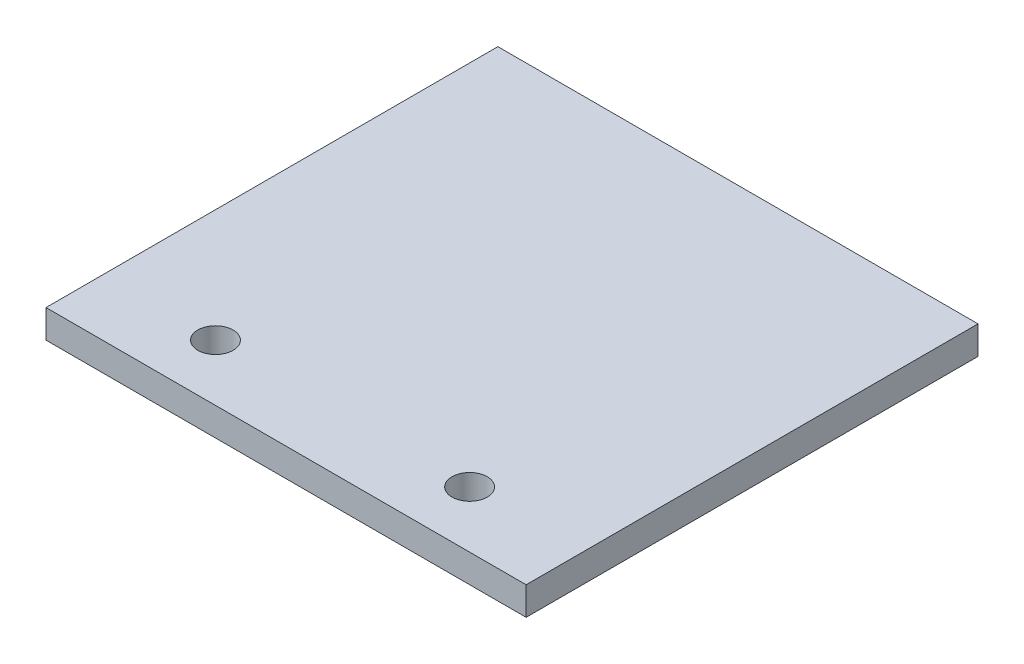
ISO-10303-21;
HEADER;
FILE_DESCRIPTION(('STEP AP214'),'2;1');
FILE_NAME('part.step','',(''),(''),'','','');
FILE_SCHEMA(('AUTOMOTIVE_DESIGN { 1 0 10303 214 1 1 1 1 }'));
ENDSEC;
DATA;
#1=APPLICATION_CONTEXT('core data for automotive mechanical design processes');
#2=APPLICATION_PROTOCOL_DEFINITION('international standard','automotive_design',2000,#1);
#3=PRODUCT_CONTEXT('',#1,'mechanical');
#4=PRODUCT('Part','Part','',(#3));
#5=PRODUCT_RELATED_PRODUCT_CATEGORY('part','',(#4));
#6=PRODUCT_DEFINITION_FORMATION('','',#4);
#7=PRODUCT_DEFINITION_CONTEXT('part definition',#1,'design');
#8=PRODUCT_DEFINITION('design','',#6,#7);
#9=PRODUCT_DEFINITION_SHAPE('','',#8);
#10=(LENGTH_UNIT() NAMED_UNIT(*) SI_UNIT(.MILLI.,.METRE.));
#11=(NAMED_UNIT(*) PLANE_ANGLE_UNIT() SI_UNIT($,.RADIAN.));
#12=(NAMED_UNIT(*) SI_UNIT($,.STERADIAN.) SOLID_ANGLE_UNIT());
#13=UNCERTAINTY_MEASURE_WITH_UNIT(LENGTH_MEASURE(1.E-05),#10,'distance_accuracy_value','');
#14=(GEOMETRIC_REPRESENTATION_CONTEXT(3) GLOBAL_UNCERTAINTY_ASSIGNED_CONTEXT((#13)) GLOBAL_UNIT_ASSIGNED_CONTEXT((#10,
#11,#12)) REPRESENTATION_CONTEXT('',''));
#15=CARTESIAN_POINT('',(0.,0.,0.));
#16=DIRECTION('',(0.,0.,1.));
#17=DIRECTION('',(1.,0.,0.));
#18=AXIS2_PLACEMENT_3D('',#15,#16,#17);
#19=CARTESIAN_POINT('',(53.975,6.35,-50.8));
#20=DIRECTION('',(-1.,0.,0.));
#21=DIRECTION('',(0.,0.,1.));
#22=AXIS2_PLACEMENT_3D('',#19,#20,#21);
#23=PLANE('',#22);
#24=DIRECTION('',(0.,0.,-1.));
#25=VECTOR('',#24,1.);
#26=CARTESIAN_POINT('',(53.975,0.,-50.8));
#27=LINE('',#26,#25);
#28=CARTESIAN_POINT('',(53.975,0.,50.8));
#29=VERTEX_POINT('',#28);
#30=CARTESIAN_POINT('',(53.975,0.,-50.8));
#31=VERTEX_POINT('',#30);
#32=EDGE_CURVE('E96',#29,#31,#27,.T.);
#33=ORIENTED_EDGE('',*,*,#32,.T.);
#34=DIRECTION('',(0.,-1.,0.));
#35=VECTOR('',#34,1.);
#36=CARTESIAN_POINT('',(53.975,6.35,-50.8));
#37=LINE('',#36,#35);
#38=CARTESIAN_POINT('',(53.975,6.35,-50.8));
#39=VERTEX_POINT('',#38);
#40=EDGE_CURVE('E11',#39,#31,#37,.T.);
#41=ORIENTED_EDGE('',*,*,#40,.F.);
#42=DIRECTION('',(0.,0.,-1.));
#43=VECTOR('',#42,1.);
#44=CARTESIAN_POINT('',(53.975,6.35,-50.8));
#45=LINE('',#44,#43);
#46=CARTESIAN_POINT('',(53.975,6.35,50.8));
#47=VERTEX_POINT('',#46);
#48=EDGE_CURVE('E84',#47,#39,#45,.T.);
#49=ORIENTED_EDGE('',*,*,#48,.F.);
#50=DIRECTION('',(0.,-1.,0.));
#51=VECTOR('',#50,1.);
#52=CARTESIAN_POINT('',(53.975,6.35,50.8));
#53=LINE('',#52,#51);
#54=EDGE_CURVE('E92',#47,#29,#53,.T.);
#55=ORIENTED_EDGE('',*,*,#54,.T.);
#56=EDGE_LOOP('',(#33,#41,#49,#55));
#57=FACE_BOUND('',#56,.T.);
#58=ADVANCED_FACE('F33',(#57),#23,.F.);
#59=CARTESIAN_POINT('',(-53.975,6.35,-50.8));
#60=DIRECTION('',(0.,0.,1.));
#61=DIRECTION('',(1.,0.,0.));
#62=AXIS2_PLACEMENT_3D('',#59,#60,#61);
#63=PLANE('',#62);
#64=DIRECTION('',(-1.,0.,0.));
#65=VECTOR('',#64,1.);
#66=CARTESIAN_POINT('',(-53.975,0.,-50.8));
#67=LINE('',#66,#65);
#68=CARTESIAN_POINT('',(-53.975,0.,-50.8));
#69=VERTEX_POINT('',#68);
#70=EDGE_CURVE('E88',#31,#69,#67,.T.);
#71=ORIENTED_EDGE('',*,*,#70,.T.);
#72=DIRECTION('',(0.,-1.,0.));
#73=VECTOR('',#72,1.);
#74=CARTESIAN_POINT('',(-53.975,6.35,-50.8));
#75=LINE('',#74,#73);
#76=CARTESIAN_POINT('',(-53.975,6.35,-50.8));
#77=VERTEX_POINT('',#76);
#78=EDGE_CURVE('E41',#77,#69,#75,.T.);
#79=ORIENTED_EDGE('',*,*,#78,.F.);
#80=DIRECTION('',(-1.,0.,0.));
#81=VECTOR('',#80,1.);
#82=CARTESIAN_POINT('',(-53.975,6.35,-50.8));
#83=LINE('',#82,#81);
#84=EDGE_CURVE('E79',#39,#77,#83,.T.);
#85=ORIENTED_EDGE('',*,*,#84,.F.);
#86=ORIENTED_EDGE('',*,*,#40,.T.);
#87=EDGE_LOOP('',(#71,#79,#85,#86));
#88=FACE_BOUND('',#87,.T.);
#89=ADVANCED_FACE('F87',(#88),#63,.F.);
#90=CARTESIAN_POINT('',(-53.975,6.35,-50.8));
#91=DIRECTION('',(1.,0.,0.));
#92=DIRECTION('',(0.,0.,-1.));
#93=AXIS2_PLACEMENT_3D('',#90,#91,#92);
#94=PLANE('',#93);
#95=DIRECTION('',(0.,0.,1.));
#96=VECTOR('',#95,1.);
#97=CARTESIAN_POINT('',(-53.975,0.,-50.8));
#98=LINE('',#97,#96);
#99=CARTESIAN_POINT('',(-53.975,0.,50.8));
#100=VERTEX_POINT('',#99);
#101=EDGE_CURVE('E66',#69,#100,#98,.T.);
#102=ORIENTED_EDGE('',*,*,#101,.T.);
#103=DIRECTION('',(0.,-1.,0.));
#104=VECTOR('',#103,1.);
#105=CARTESIAN_POINT('',(-53.975,6.35,50.8));
#106=LINE('',#105,#104);
#107=CARTESIAN_POINT('',(-53.975,6.35,50.8));
#108=VERTEX_POINT('',#107);
#109=EDGE_CURVE('E89',#108,#100,#106,.T.);
#110=ORIENTED_EDGE('',*,*,#109,.F.);
#111=DIRECTION('',(0.,0.,1.));
#112=VECTOR('',#111,1.);
#113=CARTESIAN_POINT('',(-53.975,6.35,-50.8));
#114=LINE('',#113,#112);
#115=EDGE_CURVE('E82',#77,#108,#114,.T.);
#116=ORIENTED_EDGE('',*,*,#115,.F.);
#117=ORIENTED_EDGE('',*,*,#78,.T.);
#118=EDGE_LOOP('',(#102,#110,#116,#117));
#119=FACE_BOUND('',#118,.T.);
#120=ADVANCED_FACE('F90',(#119),#94,.F.);
#121=CARTESIAN_POINT('',(-53.975,6.35,50.8));
#122=DIRECTION('',(0.,0.,-1.));
#123=DIRECTION('',(-1.,0.,0.));
#124=AXIS2_PLACEMENT_3D('',#121,#122,#123);
#125=PLANE('',#124);
#126=DIRECTION('',(1.,0.,0.));
#127=VECTOR('',#126,1.);
#128=CARTESIAN_POINT('',(-53.975,0.,50.8));
#129=LINE('',#128,#127);
#130=EDGE_CURVE('E72',#100,#29,#129,.T.);
#131=ORIENTED_EDGE('',*,*,#130,.T.);
#132=ORIENTED_EDGE('',*,*,#54,.F.);
#133=DIRECTION('',(1.,0.,0.));
#134=VECTOR('',#133,1.);
#135=CARTESIAN_POINT('',(-53.975,6.35,50.8));
#136=LINE('',#135,#134);
#137=EDGE_CURVE('E49',#108,#47,#136,.T.);
#138=ORIENTED_EDGE('',*,*,#137,.F.);
#139=ORIENTED_EDGE('',*,*,#109,.T.);
#140=EDGE_LOOP('',(#131,#132,#138,#139));
#141=FACE_BOUND('',#140,.T.);
#142=ADVANCED_FACE('F104',(#141),#125,.F.);
#143=CARTESIAN_POINT('',(0.,6.35,0.));
#144=DIRECTION('',(0.,1.,0.));
#145=DIRECTION('',(0.,0.,1.));
#146=AXIS2_PLACEMENT_3D('',#143,#144,#145);
#147=PLANE('',#146);
#148=CARTESIAN_POINT('',(28.575,6.35,38.1));
#149=DIRECTION('',(0.,1.,0.));
#150=DIRECTION('',(0.,0.,-1.));
#151=AXIS2_PLACEMENT_3D('',#148,#149,#150);
#152=CIRCLE('',#151,3.96875);
#153=CARTESIAN_POINT('',(28.575,6.35,34.13125));
#154=VERTEX_POINT('',#153);
#155=EDGE_CURVE('E118',#154,#154,#152,.T.);
#156=ORIENTED_EDGE('',*,*,#155,.F.);
#157=EDGE_LOOP('',(#156));
#158=FACE_BOUND('',#157,.T.);
#159=CARTESIAN_POINT('',(-28.575,6.35,38.1));
#160=DIRECTION('',(0.,1.,0.));
#161=DIRECTION('',(0.,0.,1.));
#162=AXIS2_PLACEMENT_3D('',#159,#160,#161);
#163=CIRCLE('',#162,3.96875);
#164=CARTESIAN_POINT('',(-28.575,6.35,42.06875));
#165=VERTEX_POINT('',#164);
#166=EDGE_CURVE('E112',#165,#165,#163,.T.);
#167=ORIENTED_EDGE('',*,*,#166,.F.);
#168=EDGE_LOOP('',(#167));
#169=FACE_BOUND('',#168,.T.);
#170=ORIENTED_EDGE('',*,*,#48,.T.);
#171=ORIENTED_EDGE('',*,*,#84,.T.);
#172=ORIENTED_EDGE('',*,*,#115,.T.);
#173=ORIENTED_EDGE('',*,*,#137,.T.);
#174=EDGE_LOOP('',(#170,#171,#172,#173));
#175=FACE_BOUND('',#174,.T.);
#176=ADVANCED_FACE('F80',(#158,#169,#175),#147,.T.);
#177=CARTESIAN_POINT('',(0.,0.,0.));
#178=DIRECTION('',(0.,1.,0.));
#179=DIRECTION('',(0.,0.,1.));
#180=AXIS2_PLACEMENT_3D('',#177,#178,#179);
#181=PLANE('',#180);
#182=CARTESIAN_POINT('',(28.575,0.,38.1));
#183=DIRECTION('',(0.,1.,0.));
#184=DIRECTION('',(0.,0.,1.));
#185=AXIS2_PLACEMENT_3D('',#182,#183,#184);
#186=CIRCLE('',#185,3.96875);
#187=CARTESIAN_POINT('',(28.575,0.,42.06875));
#188=VERTEX_POINT('',#187);
#189=EDGE_CURVE('E115',#188,#188,#186,.F.);
#190=ORIENTED_EDGE('',*,*,#189,.F.);
#191=EDGE_LOOP('',(#190));
#192=FACE_BOUND('',#191,.T.);
#193=CARTESIAN_POINT('',(-28.575,0.,38.1));
#194=DIRECTION('',(0.,1.,0.));
#195=DIRECTION('',(0.,0.,1.));
#196=AXIS2_PLACEMENT_3D('',#193,#194,#195);
#197=CIRCLE('',#196,3.96875);
#198=CARTESIAN_POINT('',(-28.575,0.,42.06875));
#199=VERTEX_POINT('',#198);
#200=EDGE_CURVE('E99',#199,#199,#197,.F.);
#201=ORIENTED_EDGE('',*,*,#200,.F.);
#202=EDGE_LOOP('',(#201));
#203=FACE_BOUND('',#202,.T.);
#204=ORIENTED_EDGE('',*,*,#32,.F.);
#205=ORIENTED_EDGE('',*,*,#130,.F.);
#206=ORIENTED_EDGE('',*,*,#101,.F.);
#207=ORIENTED_EDGE('',*,*,#70,.F.);
#208=EDGE_LOOP('',(#204,#205,#206,#207));
#209=FACE_BOUND('',#208,.T.);
#210=ADVANCED_FACE('F107',(#192,#203,#209),#181,.F.);
#211=CARTESIAN_POINT('',(-28.575,-0.00100000000000013,38.1));
#212=DIRECTION('',(0.,1.,0.));
#213=DIRECTION('',(0.,0.,1.));
#214=AXIS2_PLACEMENT_3D('',#211,#212,#213);
#215=CYLINDRICAL_SURFACE('',#214,3.96875);
#216=ORIENTED_EDGE('',*,*,#166,.T.);
#217=EDGE_LOOP('',(#216));
#218=FACE_BOUND('',#217,.T.);
#219=ORIENTED_EDGE('',*,*,#200,.T.);
#220=EDGE_LOOP('',(#219));
#221=FACE_BOUND('',#220,.T.);
#222=ADVANCED_FACE('F130',(#218,#221),#215,.F.);
#223=CARTESIAN_POINT('',(28.575,-0.00100000000000013,38.1));
#224=DIRECTION('',(0.,1.,0.));
#225=DIRECTION('',(0.,0.,1.));
#226=AXIS2_PLACEMENT_3D('',#223,#224,#225);
#227=CYLINDRICAL_SURFACE('',#226,3.96875);
#228=ORIENTED_EDGE('',*,*,#155,.T.);
#229=EDGE_LOOP('',(#228));
#230=FACE_BOUND('',#229,.T.);
#231=ORIENTED_EDGE('',*,*,#189,.T.);
#232=EDGE_LOOP('',(#231));
#233=FACE_BOUND('',#232,.T.);
#234=ADVANCED_FACE('F122',(#230,#233),#227,.F.);
#235=CLOSED_SHELL('',(#58,#89,#120,#142,#176,#210,#222,#234));
#236=MANIFOLD_SOLID_BREP('B2',#235);
#237=ADVANCED_BREP_SHAPE_REPRESENTATION('',(#18,#236),#14);
#238=SHAPE_DEFINITION_REPRESENTATION(#9,#237);
ENDSEC;
END-ISO-10303-21;
